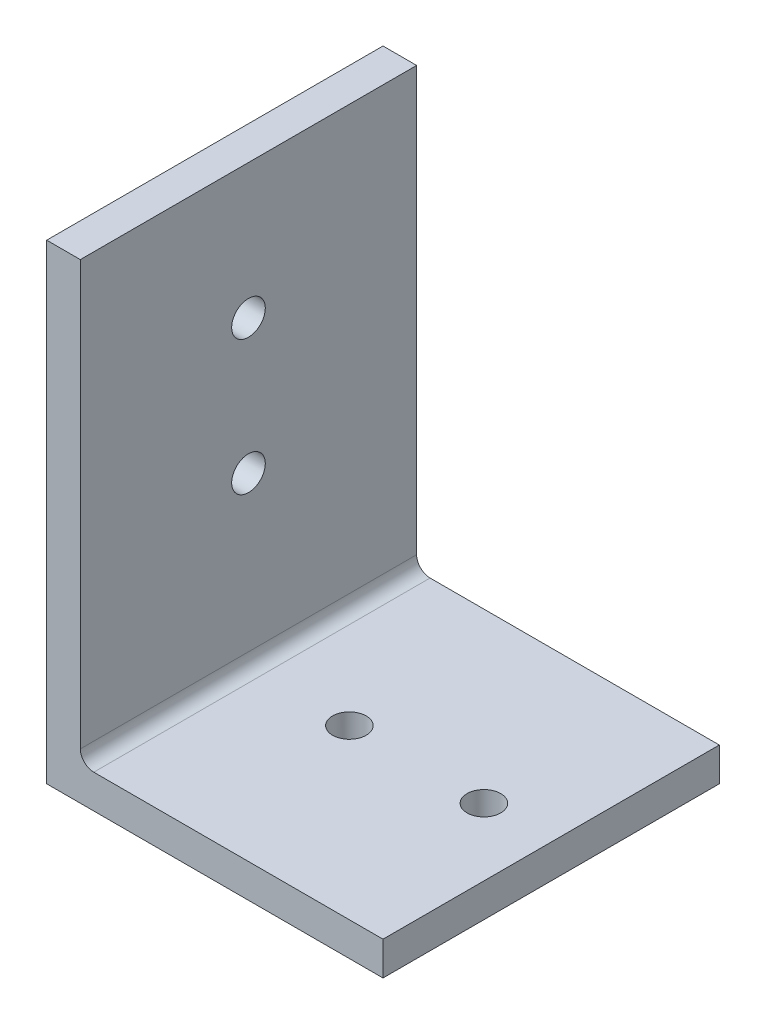
ISO-10303-21;
HEADER;
FILE_DESCRIPTION(('STEP AP214'),'2;1');
FILE_NAME('part.step','',(''),(''),'','','');
FILE_SCHEMA(('AUTOMOTIVE_DESIGN { 1 0 10303 214 1 1 1 1 }'));
ENDSEC;
DATA;
#1=APPLICATION_CONTEXT('core data for automotive mechanical design processes');
#2=APPLICATION_PROTOCOL_DEFINITION('international standard','automotive_design',2000,#1);
#3=PRODUCT_CONTEXT('',#1,'mechanical');
#4=PRODUCT('Part','Part','',(#3));
#5=PRODUCT_RELATED_PRODUCT_CATEGORY('part','',(#4));
#6=PRODUCT_DEFINITION_FORMATION('','',#4);
#7=PRODUCT_DEFINITION_CONTEXT('part definition',#1,'design');
#8=PRODUCT_DEFINITION('design','',#6,#7);
#9=PRODUCT_DEFINITION_SHAPE('','',#8);
#10=(LENGTH_UNIT() NAMED_UNIT(*) SI_UNIT(.MILLI.,.METRE.));
#11=(NAMED_UNIT(*) PLANE_ANGLE_UNIT() SI_UNIT($,.RADIAN.));
#12=(NAMED_UNIT(*) SI_UNIT($,.STERADIAN.) SOLID_ANGLE_UNIT());
#13=UNCERTAINTY_MEASURE_WITH_UNIT(LENGTH_MEASURE(1.E-05),#10,'distance_accuracy_value','');
#14=(GEOMETRIC_REPRESENTATION_CONTEXT(3) GLOBAL_UNCERTAINTY_ASSIGNED_CONTEXT((#13)) GLOBAL_UNIT_ASSIGNED_CONTEXT((#10,
#11,#12)) REPRESENTATION_CONTEXT('',''));
#15=CARTESIAN_POINT('',(0.,0.,0.));
#16=DIRECTION('',(0.,0.,1.));
#17=DIRECTION('',(1.,0.,0.));
#18=AXIS2_PLACEMENT_3D('',#15,#16,#17);
#19=CARTESIAN_POINT('',(63.5,0.,31.75));
#20=DIRECTION('',(0.,1.,0.));
#21=DIRECTION('',(-1.,0.,0.));
#22=AXIS2_PLACEMENT_3D('',#19,#20,#21);
#23=PLANE('',#22);
#24=CARTESIAN_POINT('',(25.4,0.,0.));
#25=DIRECTION('',(0.,-1.,0.));
#26=DIRECTION('',(1.,0.,0.));
#27=AXIS2_PLACEMENT_3D('',#24,#25,#26);
#28=CIRCLE('',#27,3.175);
#29=CARTESIAN_POINT('',(28.575,0.,0.));
#30=VERTEX_POINT('',#29);
#31=EDGE_CURVE('E174',#30,#30,#28,.T.);
#32=ORIENTED_EDGE('',*,*,#31,.F.);
#33=EDGE_LOOP('',(#32));
#34=FACE_BOUND('',#33,.T.);
#35=CARTESIAN_POINT('',(50.8,0.,0.));
#36=DIRECTION('',(0.,-1.,0.));
#37=DIRECTION('',(1.,0.,0.));
#38=AXIS2_PLACEMENT_3D('',#35,#36,#37);
#39=CIRCLE('',#38,3.175);
#40=CARTESIAN_POINT('',(53.975,0.,0.));
#41=VERTEX_POINT('',#40);
#42=EDGE_CURVE('E173',#41,#41,#39,.T.);
#43=ORIENTED_EDGE('',*,*,#42,.F.);
#44=EDGE_LOOP('',(#43));
#45=FACE_BOUND('',#44,.T.);
#46=DIRECTION('',(1.,0.,0.));
#47=VECTOR('',#46,1.);
#48=CARTESIAN_POINT('',(63.5,0.,-31.75));
#49=LINE('',#48,#47);
#50=CARTESIAN_POINT('',(0.,0.,-31.75));
#51=VERTEX_POINT('',#50);
#52=CARTESIAN_POINT('',(63.5,0.,-31.75));
#53=VERTEX_POINT('',#52);
#54=EDGE_CURVE('E127',#51,#53,#49,.T.);
#55=ORIENTED_EDGE('',*,*,#54,.T.);
#56=DIRECTION('',(0.,0.,-1.));
#57=VECTOR('',#56,1.);
#58=CARTESIAN_POINT('',(63.5,0.,31.75));
#59=LINE('',#58,#57);
#60=CARTESIAN_POINT('',(63.5,0.,31.75));
#61=VERTEX_POINT('',#60);
#62=EDGE_CURVE('E107',#61,#53,#59,.T.);
#63=ORIENTED_EDGE('',*,*,#62,.F.);
#64=DIRECTION('',(1.,0.,0.));
#65=VECTOR('',#64,1.);
#66=CARTESIAN_POINT('',(63.5,0.,31.75));
#67=LINE('',#66,#65);
#68=CARTESIAN_POINT('',(0.,0.,31.75));
#69=VERTEX_POINT('',#68);
#70=EDGE_CURVE('E111',#69,#61,#67,.T.);
#71=ORIENTED_EDGE('',*,*,#70,.F.);
#72=DIRECTION('',(0.,0.,-1.));
#73=VECTOR('',#72,1.);
#74=CARTESIAN_POINT('',(0.,0.,31.75));
#75=LINE('',#74,#73);
#76=EDGE_CURVE('E139',#69,#51,#75,.T.);
#77=ORIENTED_EDGE('',*,*,#76,.T.);
#78=EDGE_LOOP('',(#55,#63,#71,#77));
#79=FACE_BOUND('',#78,.T.);
#80=ADVANCED_FACE('F44',(#34,#45,#79),#23,.F.);
#81=CARTESIAN_POINT('',(63.5,6.35,31.75));
#82=DIRECTION('',(-1.,0.,0.));
#83=DIRECTION('',(0.,0.,1.));
#84=AXIS2_PLACEMENT_3D('',#81,#82,#83);
#85=PLANE('',#84);
#86=DIRECTION('',(0.,1.,0.));
#87=VECTOR('',#86,1.);
#88=CARTESIAN_POINT('',(63.5,6.35,-31.75));
#89=LINE('',#88,#87);
#90=CARTESIAN_POINT('',(63.5,6.35,-31.75));
#91=VERTEX_POINT('',#90);
#92=EDGE_CURVE('E149',#53,#91,#89,.T.);
#93=ORIENTED_EDGE('',*,*,#92,.T.);
#94=DIRECTION('',(0.,0.,-1.));
#95=VECTOR('',#94,1.);
#96=CARTESIAN_POINT('',(63.5,6.35,31.75));
#97=LINE('',#96,#95);
#98=CARTESIAN_POINT('',(63.5,6.35,31.75));
#99=VERTEX_POINT('',#98);
#100=EDGE_CURVE('E112',#99,#91,#97,.T.);
#101=ORIENTED_EDGE('',*,*,#100,.F.);
#102=DIRECTION('',(0.,1.,0.));
#103=VECTOR('',#102,1.);
#104=CARTESIAN_POINT('',(63.5,6.35,31.75));
#105=LINE('',#104,#103);
#106=EDGE_CURVE('E102',#61,#99,#105,.T.);
#107=ORIENTED_EDGE('',*,*,#106,.F.);
#108=ORIENTED_EDGE('',*,*,#62,.T.);
#109=EDGE_LOOP('',(#93,#101,#107,#108));
#110=FACE_BOUND('',#109,.T.);
#111=ADVANCED_FACE('F106',(#110),#85,.F.);
#112=CARTESIAN_POINT('',(6.35,6.35,31.75));
#113=DIRECTION('',(0.,-1.,0.));
#114=DIRECTION('',(0.,0.,-1.));
#115=AXIS2_PLACEMENT_3D('',#112,#113,#114);
#116=PLANE('',#115);
#117=CARTESIAN_POINT('',(25.4,6.34999999999999,0.));
#118=DIRECTION('',(0.,-1.,0.));
#119=DIRECTION('',(0.,0.,-1.));
#120=AXIS2_PLACEMENT_3D('',#117,#118,#119);
#121=CIRCLE('',#120,3.175);
#122=CARTESIAN_POINT('',(25.4,6.34999999999999,-3.175));
#123=VERTEX_POINT('',#122);
#124=EDGE_CURVE('E167',#123,#123,#121,.F.);
#125=ORIENTED_EDGE('',*,*,#124,.F.);
#126=EDGE_LOOP('',(#125));
#127=FACE_BOUND('',#126,.T.);
#128=CARTESIAN_POINT('',(50.8,6.34999999999999,0.));
#129=DIRECTION('',(0.,-1.,0.));
#130=DIRECTION('',(0.,0.,-1.));
#131=AXIS2_PLACEMENT_3D('',#128,#129,#130);
#132=CIRCLE('',#131,3.175);
#133=CARTESIAN_POINT('',(50.8,6.34999999999999,-3.175));
#134=VERTEX_POINT('',#133);
#135=EDGE_CURVE('E172',#134,#134,#132,.F.);
#136=ORIENTED_EDGE('',*,*,#135,.F.);
#137=EDGE_LOOP('',(#136));
#138=FACE_BOUND('',#137,.T.);
#139=DIRECTION('',(-1.,0.,0.));
#140=VECTOR('',#139,1.);
#141=CARTESIAN_POINT('',(6.35,6.35,-31.75));
#142=LINE('',#141,#140);
#143=CARTESIAN_POINT('',(8.89,6.35,-31.75));
#144=VERTEX_POINT('',#143);
#145=EDGE_CURVE('E150',#91,#144,#142,.T.);
#146=ORIENTED_EDGE('',*,*,#145,.T.);
#147=DIRECTION('',(0.,0.,-1.));
#148=VECTOR('',#147,1.);
#149=CARTESIAN_POINT('',(8.89,6.35,31.75));
#150=LINE('',#149,#148);
#151=CARTESIAN_POINT('',(8.89,6.35,31.75));
#152=VERTEX_POINT('',#151);
#153=EDGE_CURVE('E58',#144,#152,#150,.F.);
#154=ORIENTED_EDGE('',*,*,#153,.T.);
#155=DIRECTION('',(-1.,0.,0.));
#156=VECTOR('',#155,1.);
#157=CARTESIAN_POINT('',(6.35,6.35,31.75));
#158=LINE('',#157,#156);
#159=EDGE_CURVE('E114',#99,#152,#158,.T.);
#160=ORIENTED_EDGE('',*,*,#159,.F.);
#161=ORIENTED_EDGE('',*,*,#100,.T.);
#162=EDGE_LOOP('',(#146,#154,#160,#161));
#163=FACE_BOUND('',#162,.T.);
#164=ADVANCED_FACE('F197',(#127,#138,#163),#116,.F.);
#165=CARTESIAN_POINT('',(6.34999999999999,88.9,31.75));
#166=DIRECTION('',(-1.,0.,0.));
#167=DIRECTION('',(0.,-1.,0.));
#168=AXIS2_PLACEMENT_3D('',#165,#166,#167);
#169=PLANE('',#168);
#170=CARTESIAN_POINT('',(6.34999999999999,63.5,0.));
#171=DIRECTION('',(-1.,0.,0.));
#172=DIRECTION('',(0.,-1.,0.));
#173=AXIS2_PLACEMENT_3D('',#170,#171,#172);
#174=CIRCLE('',#173,3.175);
#175=CARTESIAN_POINT('',(6.34999999999999,60.325,0.));
#176=VERTEX_POINT('',#175);
#177=EDGE_CURVE('E155',#176,#176,#174,.F.);
#178=ORIENTED_EDGE('',*,*,#177,.F.);
#179=EDGE_LOOP('',(#178));
#180=FACE_BOUND('',#179,.T.);
#181=CARTESIAN_POINT('',(6.35,38.1,0.));
#182=DIRECTION('',(-1.,0.,0.));
#183=DIRECTION('',(0.,-1.,0.));
#184=AXIS2_PLACEMENT_3D('',#181,#182,#183);
#185=CIRCLE('',#184,3.175);
#186=CARTESIAN_POINT('',(6.35,34.925,0.));
#187=VERTEX_POINT('',#186);
#188=EDGE_CURVE('E162',#187,#187,#185,.F.);
#189=ORIENTED_EDGE('',*,*,#188,.F.);
#190=EDGE_LOOP('',(#189));
#191=FACE_BOUND('',#190,.T.);
#192=DIRECTION('',(0.,1.,0.));
#193=VECTOR('',#192,1.);
#194=CARTESIAN_POINT('',(6.34999999999999,88.9,31.75));
#195=LINE('',#194,#193);
#196=CARTESIAN_POINT('',(6.35,8.89,31.75));
#197=VERTEX_POINT('',#196);
#198=CARTESIAN_POINT('',(6.34999999999999,88.9,31.75));
#199=VERTEX_POINT('',#198);
#200=EDGE_CURVE('E156',#197,#199,#195,.T.);
#201=ORIENTED_EDGE('',*,*,#200,.F.);
#202=DIRECTION('',(0.,0.,-1.));
#203=VECTOR('',#202,1.);
#204=CARTESIAN_POINT('',(6.35,8.89,-31.75));
#205=LINE('',#204,#203);
#206=CARTESIAN_POINT('',(6.35,8.89,-31.75));
#207=VERTEX_POINT('',#206);
#208=EDGE_CURVE('E130',#197,#207,#205,.T.);
#209=ORIENTED_EDGE('',*,*,#208,.T.);
#210=DIRECTION('',(0.,1.,0.));
#211=VECTOR('',#210,1.);
#212=CARTESIAN_POINT('',(6.34999999999999,88.9,-31.75));
#213=LINE('',#212,#211);
#214=CARTESIAN_POINT('',(6.34999999999999,88.9,-31.75));
#215=VERTEX_POINT('',#214);
#216=EDGE_CURVE('E144',#207,#215,#213,.T.);
#217=ORIENTED_EDGE('',*,*,#216,.T.);
#218=DIRECTION('',(0.,0.,-1.));
#219=VECTOR('',#218,1.);
#220=CARTESIAN_POINT('',(6.34999999999999,88.9,31.75));
#221=LINE('',#220,#219);
#222=EDGE_CURVE('E133',#199,#215,#221,.T.);
#223=ORIENTED_EDGE('',*,*,#222,.F.);
#224=EDGE_LOOP('',(#201,#209,#217,#223));
#225=FACE_BOUND('',#224,.T.);
#226=ADVANCED_FACE('F200',(#180,#191,#225),#169,.F.);
#227=CARTESIAN_POINT('',(0.,88.9,31.75));
#228=DIRECTION('',(0.,-1.,0.));
#229=DIRECTION('',(0.,0.,-1.));
#230=AXIS2_PLACEMENT_3D('',#227,#228,#229);
#231=PLANE('',#230);
#232=DIRECTION('',(-1.,0.,0.));
#233=VECTOR('',#232,1.);
#234=CARTESIAN_POINT('',(0.,88.9,-31.75));
#235=LINE('',#234,#233);
#236=CARTESIAN_POINT('',(0.,88.9,-31.75));
#237=VERTEX_POINT('',#236);
#238=EDGE_CURVE('E141',#215,#237,#235,.T.);
#239=ORIENTED_EDGE('',*,*,#238,.T.);
#240=DIRECTION('',(0.,0.,-1.));
#241=VECTOR('',#240,1.);
#242=CARTESIAN_POINT('',(0.,88.9,31.75));
#243=LINE('',#242,#241);
#244=CARTESIAN_POINT('',(0.,88.9,31.75));
#245=VERTEX_POINT('',#244);
#246=EDGE_CURVE('E140',#245,#237,#243,.T.);
#247=ORIENTED_EDGE('',*,*,#246,.F.);
#248=DIRECTION('',(-1.,0.,0.));
#249=VECTOR('',#248,1.);
#250=CARTESIAN_POINT('',(0.,88.9,31.75));
#251=LINE('',#250,#249);
#252=EDGE_CURVE('E152',#199,#245,#251,.T.);
#253=ORIENTED_EDGE('',*,*,#252,.F.);
#254=ORIENTED_EDGE('',*,*,#222,.T.);
#255=EDGE_LOOP('',(#239,#247,#253,#254));
#256=FACE_BOUND('',#255,.T.);
#257=ADVANCED_FACE('F215',(#256),#231,.F.);
#258=CARTESIAN_POINT('',(0.,0.,31.75));
#259=DIRECTION('',(1.,0.,0.));
#260=DIRECTION('',(0.,0.,-1.));
#261=AXIS2_PLACEMENT_3D('',#258,#259,#260);
#262=PLANE('',#261);
#263=CARTESIAN_POINT('',(0.,63.5,0.));
#264=DIRECTION('',(-1.,0.,0.));
#265=DIRECTION('',(0.,0.,1.));
#266=AXIS2_PLACEMENT_3D('',#263,#264,#265);
#267=CIRCLE('',#266,3.175);
#268=CARTESIAN_POINT('',(0.,63.5,3.175));
#269=VERTEX_POINT('',#268);
#270=EDGE_CURVE('E165',#269,#269,#267,.T.);
#271=ORIENTED_EDGE('',*,*,#270,.F.);
#272=EDGE_LOOP('',(#271));
#273=FACE_BOUND('',#272,.T.);
#274=CARTESIAN_POINT('',(0.,38.1,0.));
#275=DIRECTION('',(-1.,0.,0.));
#276=DIRECTION('',(0.,0.,1.));
#277=AXIS2_PLACEMENT_3D('',#274,#275,#276);
#278=CIRCLE('',#277,3.175);
#279=CARTESIAN_POINT('',(0.,38.1,3.175));
#280=VERTEX_POINT('',#279);
#281=EDGE_CURVE('E157',#280,#280,#278,.T.);
#282=ORIENTED_EDGE('',*,*,#281,.F.);
#283=EDGE_LOOP('',(#282));
#284=FACE_BOUND('',#283,.T.);
#285=DIRECTION('',(0.,-1.,0.));
#286=VECTOR('',#285,1.);
#287=CARTESIAN_POINT('',(0.,0.,-31.75));
#288=LINE('',#287,#286);
#289=EDGE_CURVE('E122',#237,#51,#288,.T.);
#290=ORIENTED_EDGE('',*,*,#289,.T.);
#291=ORIENTED_EDGE('',*,*,#76,.F.);
#292=DIRECTION('',(0.,-1.,0.));
#293=VECTOR('',#292,1.);
#294=CARTESIAN_POINT('',(0.,0.,31.75));
#295=LINE('',#294,#293);
#296=EDGE_CURVE('E119',#245,#69,#295,.T.);
#297=ORIENTED_EDGE('',*,*,#296,.F.);
#298=ORIENTED_EDGE('',*,*,#246,.T.);
#299=EDGE_LOOP('',(#290,#291,#297,#298));
#300=FACE_BOUND('',#299,.T.);
#301=ADVANCED_FACE('F214',(#273,#284,#300),#262,.F.);
#302=CARTESIAN_POINT('',(0.,0.,31.75));
#303=DIRECTION('',(0.,0.,-1.));
#304=DIRECTION('',(-1.,0.,0.));
#305=AXIS2_PLACEMENT_3D('',#302,#303,#304);
#306=PLANE('',#305);
#307=ORIENTED_EDGE('',*,*,#70,.T.);
#308=ORIENTED_EDGE('',*,*,#106,.T.);
#309=ORIENTED_EDGE('',*,*,#159,.T.);
#310=CARTESIAN_POINT('',(8.89,8.89,31.75));
#311=DIRECTION('',(0.,0.,-1.));
#312=DIRECTION('',(-1.,0.,0.));
#313=AXIS2_PLACEMENT_3D('',#310,#311,#312);
#314=CIRCLE('',#313,2.54);
#315=EDGE_CURVE('E11',#152,#197,#314,.T.);
#316=ORIENTED_EDGE('',*,*,#315,.T.);
#317=ORIENTED_EDGE('',*,*,#200,.T.);
#318=ORIENTED_EDGE('',*,*,#252,.T.);
#319=ORIENTED_EDGE('',*,*,#296,.T.);
#320=EDGE_LOOP('',(#307,#308,#309,#316,#317,#318,#319));
#321=FACE_BOUND('',#320,.T.);
#322=ADVANCED_FACE('F120',(#321),#306,.F.);
#323=CARTESIAN_POINT('',(0.,0.,-31.75));
#324=DIRECTION('',(0.,0.,-1.));
#325=DIRECTION('',(-1.,0.,0.));
#326=AXIS2_PLACEMENT_3D('',#323,#324,#325);
#327=PLANE('',#326);
#328=ORIENTED_EDGE('',*,*,#54,.F.);
#329=ORIENTED_EDGE('',*,*,#289,.F.);
#330=ORIENTED_EDGE('',*,*,#238,.F.);
#331=ORIENTED_EDGE('',*,*,#216,.F.);
#332=CARTESIAN_POINT('',(8.89,8.89,-31.75));
#333=DIRECTION('',(0.,0.,-1.));
#334=DIRECTION('',(-1.,0.,0.));
#335=AXIS2_PLACEMENT_3D('',#332,#333,#334);
#336=CIRCLE('',#335,2.54);
#337=EDGE_CURVE('E52',#207,#144,#336,.F.);
#338=ORIENTED_EDGE('',*,*,#337,.T.);
#339=ORIENTED_EDGE('',*,*,#145,.F.);
#340=ORIENTED_EDGE('',*,*,#92,.F.);
#341=EDGE_LOOP('',(#328,#329,#330,#331,#338,#339,#340));
#342=FACE_BOUND('',#341,.T.);
#343=ADVANCED_FACE('F216',(#342),#327,.T.);
#344=CARTESIAN_POINT('',(63.501,38.1,0.));
#345=DIRECTION('',(-1.,0.,0.));
#346=DIRECTION('',(0.,0.,1.));
#347=AXIS2_PLACEMENT_3D('',#344,#345,#346);
#348=CYLINDRICAL_SURFACE('',#347,3.175);
#349=ORIENTED_EDGE('',*,*,#281,.T.);
#350=EDGE_LOOP('',(#349));
#351=FACE_BOUND('',#350,.T.);
#352=ORIENTED_EDGE('',*,*,#188,.T.);
#353=EDGE_LOOP('',(#352));
#354=FACE_BOUND('',#353,.T.);
#355=ADVANCED_FACE('F217',(#351,#354),#348,.F.);
#356=CARTESIAN_POINT('',(63.501,63.5,0.));
#357=DIRECTION('',(-1.,0.,0.));
#358=DIRECTION('',(0.,0.,1.));
#359=AXIS2_PLACEMENT_3D('',#356,#357,#358);
#360=CYLINDRICAL_SURFACE('',#359,3.175);
#361=ORIENTED_EDGE('',*,*,#270,.T.);
#362=EDGE_LOOP('',(#361));
#363=FACE_BOUND('',#362,.T.);
#364=ORIENTED_EDGE('',*,*,#177,.T.);
#365=EDGE_LOOP('',(#364));
#366=FACE_BOUND('',#365,.T.);
#367=ADVANCED_FACE('F192',(#363,#366),#360,.F.);
#368=CARTESIAN_POINT('',(50.8,88.901,0.));
#369=DIRECTION('',(0.,-1.,0.));
#370=DIRECTION('',(1.,0.,0.));
#371=AXIS2_PLACEMENT_3D('',#368,#369,#370);
#372=CYLINDRICAL_SURFACE('',#371,3.175);
#373=ORIENTED_EDGE('',*,*,#42,.T.);
#374=EDGE_LOOP('',(#373));
#375=FACE_BOUND('',#374,.T.);
#376=ORIENTED_EDGE('',*,*,#135,.T.);
#377=EDGE_LOOP('',(#376));
#378=FACE_BOUND('',#377,.T.);
#379=ADVANCED_FACE('F187',(#375,#378),#372,.F.);
#380=CARTESIAN_POINT('',(25.4,88.901,0.));
#381=DIRECTION('',(0.,-1.,0.));
#382=DIRECTION('',(1.,0.,0.));
#383=AXIS2_PLACEMENT_3D('',#380,#381,#382);
#384=CYLINDRICAL_SURFACE('',#383,3.175);
#385=ORIENTED_EDGE('',*,*,#31,.T.);
#386=EDGE_LOOP('',(#385));
#387=FACE_BOUND('',#386,.T.);
#388=ORIENTED_EDGE('',*,*,#124,.T.);
#389=EDGE_LOOP('',(#388));
#390=FACE_BOUND('',#389,.T.);
#391=ADVANCED_FACE('F181',(#387,#390),#384,.F.);
#392=CARTESIAN_POINT('',(8.89,8.89,31.75));
#393=DIRECTION('',(0.,0.,1.));
#394=DIRECTION('',(1.,0.,0.));
#395=AXIS2_PLACEMENT_3D('',#392,#393,#394);
#396=CYLINDRICAL_SURFACE('',#395,2.54);
#397=ORIENTED_EDGE('',*,*,#315,.F.);
#398=ORIENTED_EDGE('',*,*,#153,.F.);
#399=ORIENTED_EDGE('',*,*,#337,.F.);
#400=ORIENTED_EDGE('',*,*,#208,.F.);
#401=EDGE_LOOP('',(#397,#398,#399,#400));
#402=FACE_BOUND('',#401,.T.);
#403=ADVANCED_FACE('F50',(#402),#396,.F.);
#404=CLOSED_SHELL('',(#80,#111,#164,#226,#257,#301,#322,#343,#355,#367,#379,#391,#403));
#405=MANIFOLD_SOLID_BREP('B2',#404);
#406=ADVANCED_BREP_SHAPE_REPRESENTATION('',(#18,#405),#14);
#407=SHAPE_DEFINITION_REPRESENTATION(#9,#406);
ENDSEC;
END-ISO-10303-21;
